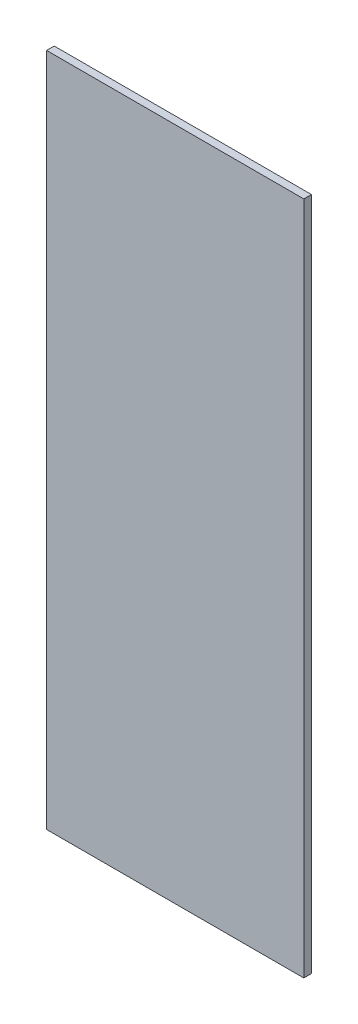
ISO-10303-21;
HEADER;
FILE_DESCRIPTION(('STEP AP214'),'2;1');
FILE_NAME('part.step','',(''),(''),'','','');
FILE_SCHEMA(('AUTOMOTIVE_DESIGN { 1 0 10303 214 1 1 1 1 }'));
ENDSEC;
DATA;
#1=APPLICATION_CONTEXT('core data for automotive mechanical design processes');
#2=APPLICATION_PROTOCOL_DEFINITION('international standard','automotive_design',2000,#1);
#3=PRODUCT_CONTEXT('',#1,'mechanical');
#4=PRODUCT('Part','Part','',(#3));
#5=PRODUCT_RELATED_PRODUCT_CATEGORY('part','',(#4));
#6=PRODUCT_DEFINITION_FORMATION('','',#4);
#7=PRODUCT_DEFINITION_CONTEXT('part definition',#1,'design');
#8=PRODUCT_DEFINITION('design','',#6,#7);
#9=PRODUCT_DEFINITION_SHAPE('','',#8);
#10=(LENGTH_UNIT() NAMED_UNIT(*) SI_UNIT(.MILLI.,.METRE.));
#11=(NAMED_UNIT(*) PLANE_ANGLE_UNIT() SI_UNIT($,.RADIAN.));
#12=(NAMED_UNIT(*) SI_UNIT($,.STERADIAN.) SOLID_ANGLE_UNIT());
#13=UNCERTAINTY_MEASURE_WITH_UNIT(LENGTH_MEASURE(1.E-05),#10,'distance_accuracy_value','');
#14=(GEOMETRIC_REPRESENTATION_CONTEXT(3) GLOBAL_UNCERTAINTY_ASSIGNED_CONTEXT((#13)) GLOBAL_UNIT_ASSIGNED_CONTEXT((#10,
#11,#12)) REPRESENTATION_CONTEXT('',''));
#15=CARTESIAN_POINT('',(0.,0.,0.));
#16=DIRECTION('',(0.,0.,1.));
#17=DIRECTION('',(1.,0.,0.));
#18=AXIS2_PLACEMENT_3D('',#15,#16,#17);
#19=CARTESIAN_POINT('',(-168.5,442.,10.));
#20=DIRECTION('',(1.,0.,0.));
#21=DIRECTION('',(0.,1.,0.));
#22=AXIS2_PLACEMENT_3D('',#19,#20,#21);
#23=PLANE('',#22);
#24=DIRECTION('',(0.,-1.,0.));
#25=VECTOR('',#24,1.);
#26=CARTESIAN_POINT('',(-168.5,442.,0.));
#27=LINE('',#26,#25);
#28=CARTESIAN_POINT('',(-168.5,442.,0.));
#29=VERTEX_POINT('',#28);
#30=CARTESIAN_POINT('',(-168.5,-442.,0.));
#31=VERTEX_POINT('',#30);
#32=EDGE_CURVE('E94',#29,#31,#27,.T.);
#33=ORIENTED_EDGE('',*,*,#32,.T.);
#34=DIRECTION('',(0.,0.,-1.));
#35=VECTOR('',#34,1.);
#36=CARTESIAN_POINT('',(-168.5,-442.,10.));
#37=LINE('',#36,#35);
#38=CARTESIAN_POINT('',(-168.5,-442.,10.));
#39=VERTEX_POINT('',#38);
#40=EDGE_CURVE('E11',#39,#31,#37,.T.);
#41=ORIENTED_EDGE('',*,*,#40,.F.);
#42=DIRECTION('',(0.,-1.,0.));
#43=VECTOR('',#42,1.);
#44=CARTESIAN_POINT('',(-168.5,442.,10.));
#45=LINE('',#44,#43);
#46=CARTESIAN_POINT('',(-168.5,442.,10.));
#47=VERTEX_POINT('',#46);
#48=EDGE_CURVE('E82',#47,#39,#45,.T.);
#49=ORIENTED_EDGE('',*,*,#48,.F.);
#50=DIRECTION('',(0.,0.,-1.));
#51=VECTOR('',#50,1.);
#52=CARTESIAN_POINT('',(-168.5,442.,10.));
#53=LINE('',#52,#51);
#54=EDGE_CURVE('E90',#47,#29,#53,.T.);
#55=ORIENTED_EDGE('',*,*,#54,.T.);
#56=EDGE_LOOP('',(#33,#41,#49,#55));
#57=FACE_BOUND('',#56,.T.);
#58=ADVANCED_FACE('F31',(#57),#23,.F.);
#59=CARTESIAN_POINT('',(-168.5,-442.,10.));
#60=DIRECTION('',(0.,1.,0.));
#61=DIRECTION('',(0.,0.,1.));
#62=AXIS2_PLACEMENT_3D('',#59,#60,#61);
#63=PLANE('',#62);
#64=DIRECTION('',(1.,0.,0.));
#65=VECTOR('',#64,1.);
#66=CARTESIAN_POINT('',(-168.5,-442.,0.));
#67=LINE('',#66,#65);
#68=CARTESIAN_POINT('',(168.5,-442.,0.));
#69=VERTEX_POINT('',#68);
#70=EDGE_CURVE('E86',#31,#69,#67,.T.);
#71=ORIENTED_EDGE('',*,*,#70,.T.);
#72=DIRECTION('',(0.,0.,-1.));
#73=VECTOR('',#72,1.);
#74=CARTESIAN_POINT('',(168.5,-442.,10.));
#75=LINE('',#74,#73);
#76=CARTESIAN_POINT('',(168.5,-442.,10.));
#77=VERTEX_POINT('',#76);
#78=EDGE_CURVE('E39',#77,#69,#75,.T.);
#79=ORIENTED_EDGE('',*,*,#78,.F.);
#80=DIRECTION('',(1.,0.,0.));
#81=VECTOR('',#80,1.);
#82=CARTESIAN_POINT('',(-168.5,-442.,10.));
#83=LINE('',#82,#81);
#84=EDGE_CURVE('E77',#39,#77,#83,.T.);
#85=ORIENTED_EDGE('',*,*,#84,.F.);
#86=ORIENTED_EDGE('',*,*,#40,.T.);
#87=EDGE_LOOP('',(#71,#79,#85,#86));
#88=FACE_BOUND('',#87,.T.);
#89=ADVANCED_FACE('F85',(#88),#63,.F.);
#90=CARTESIAN_POINT('',(168.5,442.,10.));
#91=DIRECTION('',(-1.,0.,0.));
#92=DIRECTION('',(0.,-1.,0.));
#93=AXIS2_PLACEMENT_3D('',#90,#91,#92);
#94=PLANE('',#93);
#95=DIRECTION('',(0.,1.,0.));
#96=VECTOR('',#95,1.);
#97=CARTESIAN_POINT('',(168.5,442.,0.));
#98=LINE('',#97,#96);
#99=CARTESIAN_POINT('',(168.5,442.,0.));
#100=VERTEX_POINT('',#99);
#101=EDGE_CURVE('E64',#69,#100,#98,.T.);
#102=ORIENTED_EDGE('',*,*,#101,.T.);
#103=DIRECTION('',(0.,0.,-1.));
#104=VECTOR('',#103,1.);
#105=CARTESIAN_POINT('',(168.5,442.,10.));
#106=LINE('',#105,#104);
#107=CARTESIAN_POINT('',(168.5,442.,10.));
#108=VERTEX_POINT('',#107);
#109=EDGE_CURVE('E87',#108,#100,#106,.T.);
#110=ORIENTED_EDGE('',*,*,#109,.F.);
#111=DIRECTION('',(0.,1.,0.));
#112=VECTOR('',#111,1.);
#113=CARTESIAN_POINT('',(168.5,442.,10.));
#114=LINE('',#113,#112);
#115=EDGE_CURVE('E80',#77,#108,#114,.T.);
#116=ORIENTED_EDGE('',*,*,#115,.F.);
#117=ORIENTED_EDGE('',*,*,#78,.T.);
#118=EDGE_LOOP('',(#102,#110,#116,#117));
#119=FACE_BOUND('',#118,.T.);
#120=ADVANCED_FACE('F88',(#119),#94,.F.);
#121=CARTESIAN_POINT('',(-168.5,442.,10.));
#122=DIRECTION('',(0.,-1.,0.));
#123=DIRECTION('',(1.,0.,0.));
#124=AXIS2_PLACEMENT_3D('',#121,#122,#123);
#125=PLANE('',#124);
#126=DIRECTION('',(-1.,0.,0.));
#127=VECTOR('',#126,1.);
#128=CARTESIAN_POINT('',(-168.5,442.,0.));
#129=LINE('',#128,#127);
#130=EDGE_CURVE('E70',#100,#29,#129,.T.);
#131=ORIENTED_EDGE('',*,*,#130,.T.);
#132=ORIENTED_EDGE('',*,*,#54,.F.);
#133=DIRECTION('',(-1.,0.,0.));
#134=VECTOR('',#133,1.);
#135=CARTESIAN_POINT('',(-168.5,442.,10.));
#136=LINE('',#135,#134);
#137=EDGE_CURVE('E47',#108,#47,#136,.T.);
#138=ORIENTED_EDGE('',*,*,#137,.F.);
#139=ORIENTED_EDGE('',*,*,#109,.T.);
#140=EDGE_LOOP('',(#131,#132,#138,#139));
#141=FACE_BOUND('',#140,.T.);
#142=ADVANCED_FACE('F101',(#141),#125,.F.);
#143=CARTESIAN_POINT('',(-168.5,-442.,10.));
#144=DIRECTION('',(0.,0.,1.));
#145=DIRECTION('',(1.,0.,0.));
#146=AXIS2_PLACEMENT_3D('',#143,#144,#145);
#147=PLANE('',#146);
#148=ORIENTED_EDGE('',*,*,#48,.T.);
#149=ORIENTED_EDGE('',*,*,#84,.T.);
#150=ORIENTED_EDGE('',*,*,#115,.T.);
#151=ORIENTED_EDGE('',*,*,#137,.T.);
#152=EDGE_LOOP('',(#148,#149,#150,#151));
#153=FACE_BOUND('',#152,.T.);
#154=ADVANCED_FACE('F78',(#153),#147,.T.);
#155=CARTESIAN_POINT('',(-168.5,-442.,0.));
#156=DIRECTION('',(0.,0.,1.));
#157=DIRECTION('',(1.,0.,0.));
#158=AXIS2_PLACEMENT_3D('',#155,#156,#157);
#159=PLANE('',#158);
#160=ORIENTED_EDGE('',*,*,#32,.F.);
#161=ORIENTED_EDGE('',*,*,#130,.F.);
#162=ORIENTED_EDGE('',*,*,#101,.F.);
#163=ORIENTED_EDGE('',*,*,#70,.F.);
#164=EDGE_LOOP('',(#160,#161,#162,#163));
#165=FACE_BOUND('',#164,.T.);
#166=ADVANCED_FACE('F104',(#165),#159,.F.);
#167=CLOSED_SHELL('',(#58,#89,#120,#142,#154,#166));
#168=MANIFOLD_SOLID_BREP('B2',#167);
#169=ADVANCED_BREP_SHAPE_REPRESENTATION('',(#18,#168),#14);
#170=SHAPE_DEFINITION_REPRESENTATION(#9,#169);
ENDSEC;
END-ISO-10303-21;
